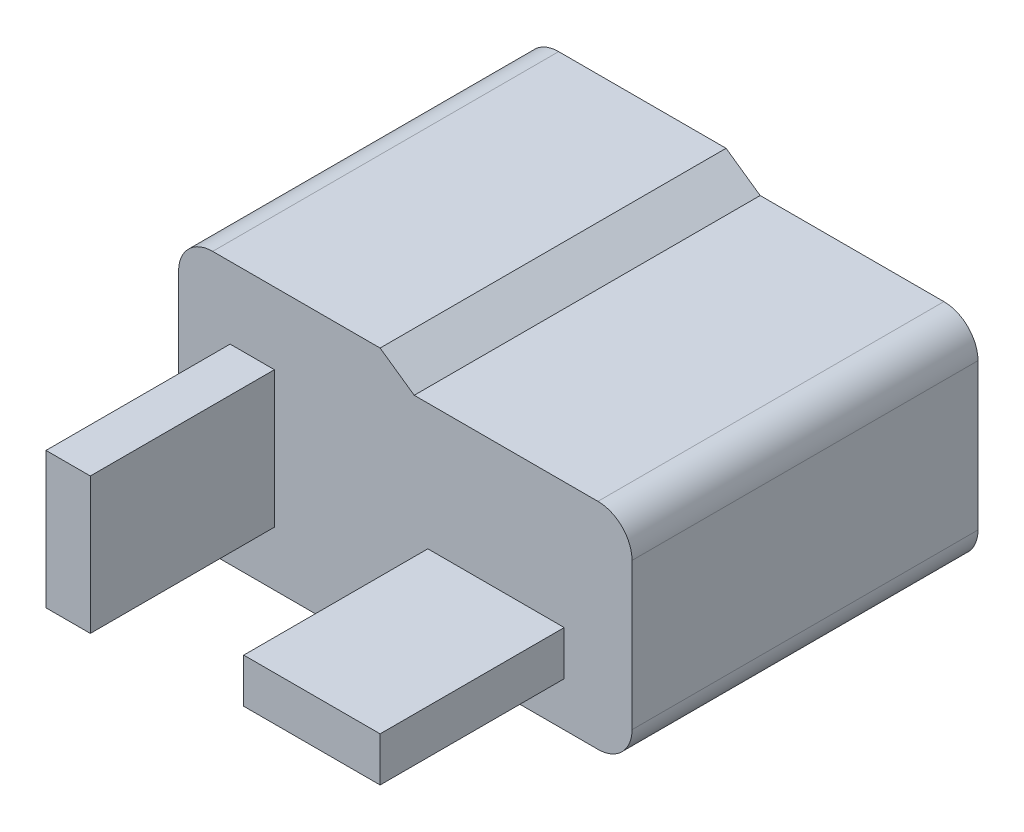
ISO-10303-21;
HEADER;
FILE_DESCRIPTION(('STEP AP214'),'2;1');
FILE_NAME('part.step','',(''),(''),'','','');
FILE_SCHEMA(('AUTOMOTIVE_DESIGN { 1 0 10303 214 1 1 1 1 }'));
ENDSEC;
DATA;
#1=APPLICATION_CONTEXT('core data for automotive mechanical design processes');
#2=APPLICATION_PROTOCOL_DEFINITION('international standard','automotive_design',2000,#1);
#3=PRODUCT_CONTEXT('',#1,'mechanical');
#4=PRODUCT('Part','Part','',(#3));
#5=PRODUCT_RELATED_PRODUCT_CATEGORY('part','',(#4));
#6=PRODUCT_DEFINITION_FORMATION('','',#4);
#7=PRODUCT_DEFINITION_CONTEXT('part definition',#1,'design');
#8=PRODUCT_DEFINITION('design','',#6,#7);
#9=PRODUCT_DEFINITION_SHAPE('','',#8);
#10=(LENGTH_UNIT() NAMED_UNIT(*) SI_UNIT(.MILLI.,.METRE.));
#11=(NAMED_UNIT(*) PLANE_ANGLE_UNIT() SI_UNIT($,.RADIAN.));
#12=(NAMED_UNIT(*) SI_UNIT($,.STERADIAN.) SOLID_ANGLE_UNIT());
#13=UNCERTAINTY_MEASURE_WITH_UNIT(LENGTH_MEASURE(1.E-05),#10,'distance_accuracy_value','');
#14=(GEOMETRIC_REPRESENTATION_CONTEXT(3) GLOBAL_UNCERTAINTY_ASSIGNED_CONTEXT((#13)) GLOBAL_UNIT_ASSIGNED_CONTEXT((#10,
#11,#12)) REPRESENTATION_CONTEXT('',''));
#15=CARTESIAN_POINT('',(0.,0.,0.));
#16=DIRECTION('',(0.,0.,1.));
#17=DIRECTION('',(1.,0.,0.));
#18=AXIS2_PLACEMENT_3D('',#15,#16,#17);
#19=CARTESIAN_POINT('',(0.,0.,9.7));
#20=DIRECTION('',(0.,0.,-1.));
#21=DIRECTION('',(-1.,0.,0.));
#22=AXIS2_PLACEMENT_3D('',#19,#20,#21);
#23=PLANE('',#22);
#24=DIRECTION('',(1.,0.,0.));
#25=VECTOR('',#24,1.);
#26=CARTESIAN_POINT('',(-0.3,-2.25,9.7));
#27=LINE('',#26,#25);
#28=CARTESIAN_POINT('',(-0.3,-2.25,9.7));
#29=VERTEX_POINT('',#28);
#30=CARTESIAN_POINT('',(-3.3,-2.25,9.7));
#31=VERTEX_POINT('',#30);
#32=EDGE_CURVE('E413',#29,#31,#27,.F.);
#33=ORIENTED_EDGE('',*,*,#32,.T.);
#34=DIRECTION('',(0.,1.,0.));
#35=VECTOR('',#34,1.);
#36=CARTESIAN_POINT('',(-3.3,-2.25,9.7));
#37=LINE('',#36,#35);
#38=CARTESIAN_POINT('',(-3.3,2.25,9.7));
#39=VERTEX_POINT('',#38);
#40=EDGE_CURVE('E417',#31,#39,#37,.T.);
#41=ORIENTED_EDGE('',*,*,#40,.T.);
#42=DIRECTION('',(1.,0.,0.));
#43=VECTOR('',#42,1.);
#44=CARTESIAN_POINT('',(-3.3,2.25,9.7));
#45=LINE('',#44,#43);
#46=CARTESIAN_POINT('',(-0.3,2.25,9.7));
#47=VERTEX_POINT('',#46);
#48=EDGE_CURVE('E419',#39,#47,#45,.T.);
#49=ORIENTED_EDGE('',*,*,#48,.T.);
#50=DIRECTION('',(0.,1.,0.));
#51=VECTOR('',#50,1.);
#52=CARTESIAN_POINT('',(-0.3,2.25,9.7));
#53=LINE('',#52,#51);
#54=EDGE_CURVE('E406',#47,#29,#53,.F.);
#55=ORIENTED_EDGE('',*,*,#54,.T.);
#56=EDGE_LOOP('',(#33,#41,#49,#55));
#57=FACE_BOUND('',#56,.T.);
#58=ADVANCED_FACE('F16',(#57),#23,.T.);
#59=CARTESIAN_POINT('',(0.,0.,9.7));
#60=DIRECTION('',(0.,0.,-1.));
#61=DIRECTION('',(-1.,0.,0.));
#62=AXIS2_PLACEMENT_3D('',#59,#60,#61);
#63=PLANE('',#62);
#64=DIRECTION('',(1.,0.,0.));
#65=VECTOR('',#64,1.);
#66=CARTESIAN_POINT('',(5.9,-1.85,9.7));
#67=LINE('',#66,#65);
#68=CARTESIAN_POINT('',(5.9,-1.85,9.7));
#69=VERTEX_POINT('',#68);
#70=CARTESIAN_POINT('',(1.4,-1.85,9.7));
#71=VERTEX_POINT('',#70);
#72=EDGE_CURVE('E396',#69,#71,#67,.F.);
#73=ORIENTED_EDGE('',*,*,#72,.T.);
#74=DIRECTION('',(0.,1.,0.));
#75=VECTOR('',#74,1.);
#76=CARTESIAN_POINT('',(1.4,-1.85,9.7));
#77=LINE('',#76,#75);
#78=CARTESIAN_POINT('',(1.4,1.15,9.7));
#79=VERTEX_POINT('',#78);
#80=EDGE_CURVE('E400',#71,#79,#77,.T.);
#81=ORIENTED_EDGE('',*,*,#80,.T.);
#82=DIRECTION('',(-1.,0.,0.));
#83=VECTOR('',#82,1.);
#84=CARTESIAN_POINT('',(1.4,1.15,9.7));
#85=LINE('',#84,#83);
#86=CARTESIAN_POINT('',(5.9,1.15,9.7));
#87=VERTEX_POINT('',#86);
#88=EDGE_CURVE('E402',#79,#87,#85,.F.);
#89=ORIENTED_EDGE('',*,*,#88,.T.);
#90=DIRECTION('',(0.,1.,0.));
#91=VECTOR('',#90,1.);
#92=CARTESIAN_POINT('',(5.9,1.15,9.7));
#93=LINE('',#92,#91);
#94=EDGE_CURVE('E389',#87,#69,#93,.F.);
#95=ORIENTED_EDGE('',*,*,#94,.T.);
#96=EDGE_LOOP('',(#73,#81,#89,#95));
#97=FACE_BOUND('',#96,.T.);
#98=ADVANCED_FACE('F584',(#97),#63,.T.);
#99=CARTESIAN_POINT('',(-3.3,2.25,9.7));
#100=DIRECTION('',(0.,1.,0.));
#101=DIRECTION('',(0.,0.,1.));
#102=AXIS2_PLACEMENT_3D('',#99,#100,#101);
#103=PLANE('',#102);
#104=DIRECTION('',(0.,0.,1.));
#105=VECTOR('',#104,1.);
#106=CARTESIAN_POINT('',(-0.3,2.25,9.7));
#107=LINE('',#106,#105);
#108=CARTESIAN_POINT('',(-0.3,2.25,0.));
#109=VERTEX_POINT('',#108);
#110=EDGE_CURVE('E408',#109,#47,#107,.T.);
#111=ORIENTED_EDGE('',*,*,#110,.T.);
#112=ORIENTED_EDGE('',*,*,#48,.F.);
#113=DIRECTION('',(0.,0.,1.));
#114=VECTOR('',#113,1.);
#115=CARTESIAN_POINT('',(-3.3,2.25,9.7));
#116=LINE('',#115,#114);
#117=CARTESIAN_POINT('',(-3.3,2.25,0.));
#118=VERTEX_POINT('',#117);
#119=EDGE_CURVE('E415',#39,#118,#116,.F.);
#120=ORIENTED_EDGE('',*,*,#119,.T.);
#121=DIRECTION('',(-1.,0.,0.));
#122=VECTOR('',#121,1.);
#123=CARTESIAN_POINT('',(7.388888888889,2.25,0.));
#124=LINE('',#123,#122);
#125=EDGE_CURVE('E342',#109,#118,#124,.T.);
#126=ORIENTED_EDGE('',*,*,#125,.F.);
#127=EDGE_LOOP('',(#111,#112,#120,#126));
#128=FACE_BOUND('',#127,.T.);
#129=ADVANCED_FACE('F581',(#128),#103,.F.);
#130=CARTESIAN_POINT('',(-3.3,-2.25,9.7));
#131=DIRECTION('',(-1.,0.,0.));
#132=DIRECTION('',(0.,0.,1.));
#133=AXIS2_PLACEMENT_3D('',#130,#131,#132);
#134=PLANE('',#133);
#135=ORIENTED_EDGE('',*,*,#119,.F.);
#136=ORIENTED_EDGE('',*,*,#40,.F.);
#137=DIRECTION('',(0.,0.,1.));
#138=VECTOR('',#137,1.);
#139=CARTESIAN_POINT('',(-3.3,-2.25,9.7));
#140=LINE('',#139,#138);
#141=CARTESIAN_POINT('',(-3.3,-2.25,0.));
#142=VERTEX_POINT('',#141);
#143=EDGE_CURVE('E411',#31,#142,#140,.F.);
#144=ORIENTED_EDGE('',*,*,#143,.T.);
#145=DIRECTION('',(0.,1.,0.));
#146=VECTOR('',#145,1.);
#147=CARTESIAN_POINT('',(-3.3,-3.85,0.));
#148=LINE('',#147,#146);
#149=EDGE_CURVE('E339',#118,#142,#148,.F.);
#150=ORIENTED_EDGE('',*,*,#149,.F.);
#151=EDGE_LOOP('',(#135,#136,#144,#150));
#152=FACE_BOUND('',#151,.T.);
#153=ADVANCED_FACE('F577',(#152),#134,.F.);
#154=CARTESIAN_POINT('',(-0.3,-2.25,9.7));
#155=DIRECTION('',(0.,-1.,0.));
#156=DIRECTION('',(1.,0.,0.));
#157=AXIS2_PLACEMENT_3D('',#154,#155,#156);
#158=PLANE('',#157);
#159=ORIENTED_EDGE('',*,*,#143,.F.);
#160=ORIENTED_EDGE('',*,*,#32,.F.);
#161=DIRECTION('',(0.,0.,1.));
#162=VECTOR('',#161,1.);
#163=CARTESIAN_POINT('',(-0.3,-2.25,9.7));
#164=LINE('',#163,#162);
#165=CARTESIAN_POINT('',(-0.3,-2.25,0.));
#166=VERTEX_POINT('',#165);
#167=EDGE_CURVE('E404',#29,#166,#164,.F.);
#168=ORIENTED_EDGE('',*,*,#167,.T.);
#169=DIRECTION('',(-1.,0.,0.));
#170=VECTOR('',#169,1.);
#171=CARTESIAN_POINT('',(7.388888888889,-2.25,0.));
#172=LINE('',#171,#170);
#173=EDGE_CURVE('E336',#142,#166,#172,.F.);
#174=ORIENTED_EDGE('',*,*,#173,.F.);
#175=EDGE_LOOP('',(#159,#160,#168,#174));
#176=FACE_BOUND('',#175,.T.);
#177=ADVANCED_FACE('F573',(#176),#158,.F.);
#178=CARTESIAN_POINT('',(-0.3,2.25,9.7));
#179=DIRECTION('',(1.,0.,0.));
#180=DIRECTION('',(0.,1.,0.));
#181=AXIS2_PLACEMENT_3D('',#178,#179,#180);
#182=PLANE('',#181);
#183=ORIENTED_EDGE('',*,*,#167,.F.);
#184=ORIENTED_EDGE('',*,*,#54,.F.);
#185=ORIENTED_EDGE('',*,*,#110,.F.);
#186=DIRECTION('',(0.,1.,0.));
#187=VECTOR('',#186,1.);
#188=CARTESIAN_POINT('',(-0.3,-3.85,0.));
#189=LINE('',#188,#187);
#190=EDGE_CURVE('E333',#166,#109,#189,.T.);
#191=ORIENTED_EDGE('',*,*,#190,.F.);
#192=EDGE_LOOP('',(#183,#184,#185,#191));
#193=FACE_BOUND('',#192,.T.);
#194=ADVANCED_FACE('F569',(#193),#182,.F.);
#195=CARTESIAN_POINT('',(1.4,1.15,9.7));
#196=DIRECTION('',(0.,1.,0.));
#197=DIRECTION('',(-1.,0.,0.));
#198=AXIS2_PLACEMENT_3D('',#195,#196,#197);
#199=PLANE('',#198);
#200=DIRECTION('',(0.,0.,-1.));
#201=VECTOR('',#200,1.);
#202=CARTESIAN_POINT('',(5.9,1.15,9.7));
#203=LINE('',#202,#201);
#204=CARTESIAN_POINT('',(5.9,1.15,0.));
#205=VERTEX_POINT('',#204);
#206=EDGE_CURVE('E391',#205,#87,#203,.F.);
#207=ORIENTED_EDGE('',*,*,#206,.T.);
#208=ORIENTED_EDGE('',*,*,#88,.F.);
#209=DIRECTION('',(0.,0.,1.));
#210=VECTOR('',#209,1.);
#211=CARTESIAN_POINT('',(1.4,1.15,9.7));
#212=LINE('',#211,#210);
#213=CARTESIAN_POINT('',(1.4,1.15,0.));
#214=VERTEX_POINT('',#213);
#215=EDGE_CURVE('E398',#79,#214,#212,.F.);
#216=ORIENTED_EDGE('',*,*,#215,.T.);
#217=DIRECTION('',(-1.,0.,0.));
#218=VECTOR('',#217,1.);
#219=CARTESIAN_POINT('',(7.388888888889,1.15,0.));
#220=LINE('',#219,#218);
#221=EDGE_CURVE('E330',#205,#214,#220,.T.);
#222=ORIENTED_EDGE('',*,*,#221,.F.);
#223=EDGE_LOOP('',(#207,#208,#216,#222));
#224=FACE_BOUND('',#223,.T.);
#225=ADVANCED_FACE('F565',(#224),#199,.F.);
#226=CARTESIAN_POINT('',(1.4,-1.85,9.7));
#227=DIRECTION('',(-1.,0.,0.));
#228=DIRECTION('',(0.,0.,1.));
#229=AXIS2_PLACEMENT_3D('',#226,#227,#228);
#230=PLANE('',#229);
#231=ORIENTED_EDGE('',*,*,#215,.F.);
#232=ORIENTED_EDGE('',*,*,#80,.F.);
#233=DIRECTION('',(0.,0.,-1.));
#234=VECTOR('',#233,1.);
#235=CARTESIAN_POINT('',(1.4,-1.85,9.7));
#236=LINE('',#235,#234);
#237=CARTESIAN_POINT('',(1.4,-1.85,0.));
#238=VERTEX_POINT('',#237);
#239=EDGE_CURVE('E394',#71,#238,#236,.T.);
#240=ORIENTED_EDGE('',*,*,#239,.T.);
#241=DIRECTION('',(0.,1.,0.));
#242=VECTOR('',#241,1.);
#243=CARTESIAN_POINT('',(1.4,-3.85,0.));
#244=LINE('',#243,#242);
#245=EDGE_CURVE('E327',#214,#238,#244,.F.);
#246=ORIENTED_EDGE('',*,*,#245,.F.);
#247=EDGE_LOOP('',(#231,#232,#240,#246));
#248=FACE_BOUND('',#247,.T.);
#249=ADVANCED_FACE('F561',(#248),#230,.F.);
#250=CARTESIAN_POINT('',(5.9,-1.85,9.7));
#251=DIRECTION('',(0.,-1.,0.));
#252=DIRECTION('',(0.,0.,-1.));
#253=AXIS2_PLACEMENT_3D('',#250,#251,#252);
#254=PLANE('',#253);
#255=ORIENTED_EDGE('',*,*,#239,.F.);
#256=ORIENTED_EDGE('',*,*,#72,.F.);
#257=DIRECTION('',(0.,0.,-1.));
#258=VECTOR('',#257,1.);
#259=CARTESIAN_POINT('',(5.9,-1.85,9.7));
#260=LINE('',#259,#258);
#261=CARTESIAN_POINT('',(5.9,-1.85,0.));
#262=VERTEX_POINT('',#261);
#263=EDGE_CURVE('E387',#69,#262,#260,.T.);
#264=ORIENTED_EDGE('',*,*,#263,.T.);
#265=DIRECTION('',(-1.,0.,0.));
#266=VECTOR('',#265,1.);
#267=CARTESIAN_POINT('',(7.388888888889,-1.85,0.));
#268=LINE('',#267,#266);
#269=EDGE_CURVE('E324',#238,#262,#268,.F.);
#270=ORIENTED_EDGE('',*,*,#269,.F.);
#271=EDGE_LOOP('',(#255,#256,#264,#270));
#272=FACE_BOUND('',#271,.T.);
#273=ADVANCED_FACE('F557',(#272),#254,.F.);
#274=CARTESIAN_POINT('',(5.9,1.15,9.7));
#275=DIRECTION('',(1.,0.,0.));
#276=DIRECTION('',(0.,0.,-1.));
#277=AXIS2_PLACEMENT_3D('',#274,#275,#276);
#278=PLANE('',#277);
#279=ORIENTED_EDGE('',*,*,#263,.F.);
#280=ORIENTED_EDGE('',*,*,#94,.F.);
#281=ORIENTED_EDGE('',*,*,#206,.F.);
#282=DIRECTION('',(0.,1.,0.));
#283=VECTOR('',#282,1.);
#284=CARTESIAN_POINT('',(5.9,-3.85,0.));
#285=LINE('',#284,#283);
#286=EDGE_CURVE('E320',#262,#205,#285,.T.);
#287=ORIENTED_EDGE('',*,*,#286,.F.);
#288=EDGE_LOOP('',(#279,#280,#281,#287));
#289=FACE_BOUND('',#288,.T.);
#290=ADVANCED_FACE('F554',(#289),#278,.F.);
#291=CARTESIAN_POINT('',(1.4,-1.85,15.547407407407));
#292=DIRECTION('',(1.,0.,0.));
#293=DIRECTION('',(0.,0.,-1.));
#294=AXIS2_PLACEMENT_3D('',#291,#292,#293);
#295=PLANE('',#294);
#296=DIRECTION('',(0.,0.,1.));
#297=VECTOR('',#296,1.);
#298=CARTESIAN_POINT('',(1.4,-1.85,15.547407407407));
#299=LINE('',#298,#297);
#300=CARTESIAN_POINT('',(1.4,-1.85,10.147407407407));
#301=VERTEX_POINT('',#300);
#302=CARTESIAN_POINT('',(1.4,-1.85,15.547407407407));
#303=VERTEX_POINT('',#302);
#304=EDGE_CURVE('E298',#301,#303,#299,.T.);
#305=ORIENTED_EDGE('',*,*,#304,.T.);
#306=DIRECTION('',(0.,1.,0.));
#307=VECTOR('',#306,1.);
#308=CARTESIAN_POINT('',(1.4,0.,15.547407407407));
#309=LINE('',#308,#307);
#310=CARTESIAN_POINT('',(1.4,-0.55,15.547407407407));
#311=VERTEX_POINT('',#310);
#312=EDGE_CURVE('E383',#303,#311,#309,.T.);
#313=ORIENTED_EDGE('',*,*,#312,.T.);
#314=DIRECTION('',(0.,0.,-1.));
#315=VECTOR('',#314,1.);
#316=CARTESIAN_POINT('',(1.4,-0.55,15.547407407407));
#317=LINE('',#316,#315);
#318=CARTESIAN_POINT('',(1.4,-0.55,10.147407407407));
#319=VERTEX_POINT('',#318);
#320=EDGE_CURVE('E300',#311,#319,#317,.T.);
#321=ORIENTED_EDGE('',*,*,#320,.T.);
#322=DIRECTION('',(0.,1.,0.));
#323=VECTOR('',#322,1.);
#324=CARTESIAN_POINT('',(1.4,-1.85,10.147407407407));
#325=LINE('',#324,#323);
#326=EDGE_CURVE('E385',#301,#319,#325,.T.);
#327=ORIENTED_EDGE('',*,*,#326,.F.);
#328=EDGE_LOOP('',(#305,#313,#321,#327));
#329=FACE_BOUND('',#328,.T.);
#330=ADVANCED_FACE('F531',(#329),#295,.F.);
#331=CARTESIAN_POINT('',(0.,0.,15.547407407407));
#332=DIRECTION('',(0.,0.,-1.));
#333=DIRECTION('',(-1.,0.,0.));
#334=AXIS2_PLACEMENT_3D('',#331,#332,#333);
#335=PLANE('',#334);
#336=ORIENTED_EDGE('',*,*,#312,.F.);
#337=DIRECTION('',(-1.,0.,0.));
#338=VECTOR('',#337,1.);
#339=CARTESIAN_POINT('',(5.4,-1.85,15.547407407407));
#340=LINE('',#339,#338);
#341=CARTESIAN_POINT('',(5.4,-1.85,15.547407407407));
#342=VERTEX_POINT('',#341);
#343=EDGE_CURVE('E296',#303,#342,#340,.F.);
#344=ORIENTED_EDGE('',*,*,#343,.T.);
#345=DIRECTION('',(0.,1.,0.));
#346=VECTOR('',#345,1.);
#347=CARTESIAN_POINT('',(5.4,-0.55,15.547407407407));
#348=LINE('',#347,#346);
#349=CARTESIAN_POINT('',(5.4,-0.55,15.547407407407));
#350=VERTEX_POINT('',#349);
#351=EDGE_CURVE('E381',#342,#350,#348,.T.);
#352=ORIENTED_EDGE('',*,*,#351,.T.);
#353=DIRECTION('',(1.,0.,0.));
#354=VECTOR('',#353,1.);
#355=CARTESIAN_POINT('',(1.4,-0.55,15.547407407407));
#356=LINE('',#355,#354);
#357=EDGE_CURVE('E303',#350,#311,#356,.F.);
#358=ORIENTED_EDGE('',*,*,#357,.T.);
#359=EDGE_LOOP('',(#336,#344,#352,#358));
#360=FACE_BOUND('',#359,.T.);
#361=ADVANCED_FACE('F536',(#360),#335,.F.);
#362=CARTESIAN_POINT('',(5.4,-0.55,15.547407407407));
#363=DIRECTION('',(-1.,0.,0.));
#364=DIRECTION('',(0.,0.,1.));
#365=AXIS2_PLACEMENT_3D('',#362,#363,#364);
#366=PLANE('',#365);
#367=DIRECTION('',(0.,0.,-1.));
#368=VECTOR('',#367,1.);
#369=CARTESIAN_POINT('',(5.4,-0.55,15.547407407407));
#370=LINE('',#369,#368);
#371=CARTESIAN_POINT('',(5.4,-0.55,10.147407407407));
#372=VERTEX_POINT('',#371);
#373=EDGE_CURVE('E306',#372,#350,#370,.F.);
#374=ORIENTED_EDGE('',*,*,#373,.T.);
#375=ORIENTED_EDGE('',*,*,#351,.F.);
#376=DIRECTION('',(0.,0.,1.));
#377=VECTOR('',#376,1.);
#378=CARTESIAN_POINT('',(5.4,-1.85,15.547407407407));
#379=LINE('',#378,#377);
#380=CARTESIAN_POINT('',(5.4,-1.85,10.147407407407));
#381=VERTEX_POINT('',#380);
#382=EDGE_CURVE('E291',#342,#381,#379,.F.);
#383=ORIENTED_EDGE('',*,*,#382,.T.);
#384=DIRECTION('',(0.,1.,0.));
#385=VECTOR('',#384,1.);
#386=CARTESIAN_POINT('',(5.4,-0.55,10.147407407407));
#387=LINE('',#386,#385);
#388=EDGE_CURVE('E208',#372,#381,#387,.F.);
#389=ORIENTED_EDGE('',*,*,#388,.F.);
#390=EDGE_LOOP('',(#374,#375,#383,#389));
#391=FACE_BOUND('',#390,.T.);
#392=ADVANCED_FACE('F540',(#391),#366,.F.);
#393=CARTESIAN_POINT('',(6.388888888889,-2.15,0.));
#394=DIRECTION('',(0.,0.,-1.));
#395=DIRECTION('',(-1.,0.,0.));
#396=AXIS2_PLACEMENT_3D('',#393,#394,#395);
#397=CYLINDRICAL_SURFACE('',#396,1.);
#398=CARTESIAN_POINT('',(6.388888888889,-2.15,10.147407407407));
#399=DIRECTION('',(0.,0.,-1.));
#400=DIRECTION('',(-1.,0.,0.));
#401=AXIS2_PLACEMENT_3D('',#398,#399,#400);
#402=CIRCLE('',#401,1.);
#403=CARTESIAN_POINT('',(7.388888888889,-2.15,10.147407407407));
#404=VERTEX_POINT('',#403);
#405=CARTESIAN_POINT('',(6.388888888889,-3.15,10.147407407407));
#406=VERTEX_POINT('',#405);
#407=EDGE_CURVE('E19',#404,#406,#402,.T.);
#408=ORIENTED_EDGE('',*,*,#407,.T.);
#409=DIRECTION('',(0.,0.,1.));
#410=VECTOR('',#409,1.);
#411=CARTESIAN_POINT('',(6.388888888889,-3.15,0.));
#412=LINE('',#411,#410);
#413=CARTESIAN_POINT('',(6.388888888889,-3.15,0.));
#414=VERTEX_POINT('',#413);
#415=EDGE_CURVE('E202',#406,#414,#412,.F.);
#416=ORIENTED_EDGE('',*,*,#415,.T.);
#417=CARTESIAN_POINT('',(6.388888888889,-2.15,0.));
#418=DIRECTION('',(0.,0.,-1.));
#419=DIRECTION('',(-1.,0.,0.));
#420=AXIS2_PLACEMENT_3D('',#417,#418,#419);
#421=CIRCLE('',#420,1.);
#422=CARTESIAN_POINT('',(7.388888888889,-2.15,0.));
#423=VERTEX_POINT('',#422);
#424=EDGE_CURVE('E323',#423,#414,#421,.T.);
#425=ORIENTED_EDGE('',*,*,#424,.F.);
#426=DIRECTION('',(0.,0.,-1.));
#427=VECTOR('',#426,1.);
#428=CARTESIAN_POINT('',(7.388888888889,-2.15,10.147407407407));
#429=LINE('',#428,#427);
#430=EDGE_CURVE('E205',#404,#423,#429,.T.);
#431=ORIENTED_EDGE('',*,*,#430,.F.);
#432=EDGE_LOOP('',(#408,#416,#425,#431));
#433=FACE_BOUND('',#432,.T.);
#434=ADVANCED_FACE('F201',(#433),#397,.T.);
#435=CARTESIAN_POINT('',(6.388888888889,2.15,0.));
#436=DIRECTION('',(0.,0.,1.));
#437=DIRECTION('',(1.,0.,0.));
#438=AXIS2_PLACEMENT_3D('',#435,#436,#437);
#439=CYLINDRICAL_SURFACE('',#438,1.);
#440=CARTESIAN_POINT('',(6.388888888889,2.15,0.));
#441=DIRECTION('',(0.,0.,1.));
#442=DIRECTION('',(1.,0.,0.));
#443=AXIS2_PLACEMENT_3D('',#440,#441,#442);
#444=CIRCLE('',#443,1.);
#445=CARTESIAN_POINT('',(6.388888888889,3.15,0.));
#446=VERTEX_POINT('',#445);
#447=CARTESIAN_POINT('',(7.388888888889,2.15,0.));
#448=VERTEX_POINT('',#447);
#449=EDGE_CURVE('E368',#446,#448,#444,.F.);
#450=ORIENTED_EDGE('',*,*,#449,.F.);
#451=DIRECTION('',(0.,0.,1.));
#452=VECTOR('',#451,1.);
#453=CARTESIAN_POINT('',(6.388888888889,3.15,0.));
#454=LINE('',#453,#452);
#455=CARTESIAN_POINT('',(6.388888888889,3.15,10.147407407407));
#456=VERTEX_POINT('',#455);
#457=EDGE_CURVE('E277',#446,#456,#454,.T.);
#458=ORIENTED_EDGE('',*,*,#457,.T.);
#459=CARTESIAN_POINT('',(6.388888888889,2.15,10.147407407407));
#460=DIRECTION('',(0.,0.,1.));
#461=DIRECTION('',(1.,0.,0.));
#462=AXIS2_PLACEMENT_3D('',#459,#460,#461);
#463=CIRCLE('',#462,1.);
#464=CARTESIAN_POINT('',(7.388888888889,2.15,10.147407407407));
#465=VERTEX_POINT('',#464);
#466=EDGE_CURVE('E207',#456,#465,#463,.F.);
#467=ORIENTED_EDGE('',*,*,#466,.T.);
#468=DIRECTION('',(0.,0.,-1.));
#469=VECTOR('',#468,1.);
#470=CARTESIAN_POINT('',(7.388888888889,2.15,10.147407407407));
#471=LINE('',#470,#469);
#472=EDGE_CURVE('E283',#448,#465,#471,.F.);
#473=ORIENTED_EDGE('',*,*,#472,.F.);
#474=EDGE_LOOP('',(#450,#458,#467,#473));
#475=FACE_BOUND('',#474,.T.);
#476=ADVANCED_FACE('F430',(#475),#439,.T.);
#477=CARTESIAN_POINT('',(0.,3.85,0.));
#478=DIRECTION('',(0.573462344363127,0.819231920519181,0.));
#479=DIRECTION('',(-0.819231920519181,0.573462344363127,0.));
#480=AXIS2_PLACEMENT_3D('',#477,#478,#479);
#481=PLANE('',#480);
#482=DIRECTION('',(0.81923192051904,-0.573462344363329,0.));
#483=VECTOR('',#482,1.);
#484=CARTESIAN_POINT('',(0.,3.85,0.));
#485=LINE('',#484,#483);
#486=CARTESIAN_POINT('',(0.,3.85,0.));
#487=VERTEX_POINT('',#486);
#488=CARTESIAN_POINT('',(1.,3.15,0.));
#489=VERTEX_POINT('',#488);
#490=EDGE_CURVE('E365',#487,#489,#485,.T.);
#491=ORIENTED_EDGE('',*,*,#490,.F.);
#492=DIRECTION('',(0.,0.,1.));
#493=VECTOR('',#492,1.);
#494=CARTESIAN_POINT('',(0.,3.85,0.));
#495=LINE('',#494,#493);
#496=CARTESIAN_POINT('',(0.,3.85,10.147407407407));
#497=VERTEX_POINT('',#496);
#498=EDGE_CURVE('E271',#497,#487,#495,.F.);
#499=ORIENTED_EDGE('',*,*,#498,.F.);
#500=DIRECTION('',(-0.819231920519181,0.573462344363127,0.));
#501=VECTOR('',#500,1.);
#502=CARTESIAN_POINT('',(0.,3.85,10.147407407407));
#503=LINE('',#502,#501);
#504=CARTESIAN_POINT('',(1.00000000000006,3.15000000000008,10.147407407407));
#505=VERTEX_POINT('',#504);
#506=EDGE_CURVE('E357',#497,#505,#503,.F.);
#507=ORIENTED_EDGE('',*,*,#506,.T.);
#508=DIRECTION('',(0.,0.,1.));
#509=VECTOR('',#508,1.);
#510=CARTESIAN_POINT('',(1.,3.15,0.));
#511=LINE('',#510,#509);
#512=EDGE_CURVE('E281',#505,#489,#511,.F.);
#513=ORIENTED_EDGE('',*,*,#512,.T.);
#514=EDGE_LOOP('',(#491,#499,#507,#513));
#515=FACE_BOUND('',#514,.T.);
#516=ADVANCED_FACE('F630',(#515),#481,.T.);
#517=CARTESIAN_POINT('',(-4.911111111111,2.85,0.));
#518=DIRECTION('',(0.,0.,1.));
#519=DIRECTION('',(1.,0.,0.));
#520=AXIS2_PLACEMENT_3D('',#517,#518,#519);
#521=CYLINDRICAL_SURFACE('',#520,1.);
#522=CARTESIAN_POINT('',(-4.911111111111,2.85,10.147407407407));
#523=DIRECTION('',(0.,0.,1.));
#524=DIRECTION('',(1.,0.,0.));
#525=AXIS2_PLACEMENT_3D('',#522,#523,#524);
#526=CIRCLE('',#525,1.);
#527=CARTESIAN_POINT('',(-5.911111111111,2.85,10.147407407407));
#528=VERTEX_POINT('',#527);
#529=CARTESIAN_POINT('',(-4.911111111111,3.85,10.147407407407));
#530=VERTEX_POINT('',#529);
#531=EDGE_CURVE('E352',#528,#530,#526,.F.);
#532=ORIENTED_EDGE('',*,*,#531,.T.);
#533=DIRECTION('',(0.,0.,1.));
#534=VECTOR('',#533,1.);
#535=CARTESIAN_POINT('',(-4.911111111111,3.85,0.));
#536=LINE('',#535,#534);
#537=CARTESIAN_POINT('',(-4.911111111111,3.85,0.));
#538=VERTEX_POINT('',#537);
#539=EDGE_CURVE('E268',#538,#530,#536,.T.);
#540=ORIENTED_EDGE('',*,*,#539,.F.);
#541=CARTESIAN_POINT('',(-4.911111111111,2.85,0.));
#542=DIRECTION('',(0.,0.,1.));
#543=DIRECTION('',(1.,0.,0.));
#544=AXIS2_PLACEMENT_3D('',#541,#542,#543);
#545=CIRCLE('',#544,1.);
#546=CARTESIAN_POINT('',(-5.911111111111,2.85,0.));
#547=VERTEX_POINT('',#546);
#548=EDGE_CURVE('E348',#547,#538,#545,.F.);
#549=ORIENTED_EDGE('',*,*,#548,.F.);
#550=DIRECTION('',(0.,0.,1.));
#551=VECTOR('',#550,1.);
#552=CARTESIAN_POINT('',(-5.911111111111,2.85,0.));
#553=LINE('',#552,#551);
#554=EDGE_CURVE('E259',#528,#547,#553,.F.);
#555=ORIENTED_EDGE('',*,*,#554,.F.);
#556=EDGE_LOOP('',(#532,#540,#549,#555));
#557=FACE_BOUND('',#556,.T.);
#558=ADVANCED_FACE('F624',(#557),#521,.T.);
#559=CARTESIAN_POINT('',(1.,-3.15,0.));
#560=DIRECTION('',(0.573462344363127,-0.819231920519181,0.));
#561=DIRECTION('',(0.819231920519181,0.573462344363127,0.));
#562=AXIS2_PLACEMENT_3D('',#559,#560,#561);
#563=PLANE('',#562);
#564=DIRECTION('',(-0.819231920519041,-0.573462344363327,0.));
#565=VECTOR('',#564,1.);
#566=CARTESIAN_POINT('',(1.,-3.15,0.));
#567=LINE('',#566,#565);
#568=CARTESIAN_POINT('',(0.999999999999999,-3.15,0.));
#569=VERTEX_POINT('',#568);
#570=CARTESIAN_POINT('',(0.,-3.85,0.));
#571=VERTEX_POINT('',#570);
#572=EDGE_CURVE('E345',#569,#571,#567,.T.);
#573=ORIENTED_EDGE('',*,*,#572,.F.);
#574=DIRECTION('',(0.,0.,1.));
#575=VECTOR('',#574,1.);
#576=CARTESIAN_POINT('',(1.,-3.15,0.));
#577=LINE('',#576,#575);
#578=CARTESIAN_POINT('',(0.999999999999999,-3.15,10.147407407407));
#579=VERTEX_POINT('',#578);
#580=EDGE_CURVE('E217',#569,#579,#577,.T.);
#581=ORIENTED_EDGE('',*,*,#580,.T.);
#582=DIRECTION('',(0.819231920519181,0.573462344363127,0.));
#583=VECTOR('',#582,1.);
#584=CARTESIAN_POINT('',(1.,-3.15,10.147407407407));
#585=LINE('',#584,#583);
#586=CARTESIAN_POINT('',(0.,-3.84999999999992,10.147407407407));
#587=VERTEX_POINT('',#586);
#588=EDGE_CURVE('E222',#579,#587,#585,.F.);
#589=ORIENTED_EDGE('',*,*,#588,.T.);
#590=DIRECTION('',(0.,0.,1.));
#591=VECTOR('',#590,1.);
#592=CARTESIAN_POINT('',(0.,-3.85,0.));
#593=LINE('',#592,#591);
#594=EDGE_CURVE('E257',#587,#571,#593,.F.);
#595=ORIENTED_EDGE('',*,*,#594,.T.);
#596=EDGE_LOOP('',(#573,#581,#589,#595));
#597=FACE_BOUND('',#596,.T.);
#598=ADVANCED_FACE('F605',(#597),#563,.T.);
#599=CARTESIAN_POINT('',(7.388888888889,-3.85,0.));
#600=DIRECTION('',(0.,0.,-1.));
#601=DIRECTION('',(-1.,0.,0.));
#602=AXIS2_PLACEMENT_3D('',#599,#600,#601);
#603=PLANE('',#602);
#604=DIRECTION('',(1.,0.,0.));
#605=VECTOR('',#604,1.);
#606=CARTESIAN_POINT('',(0.,3.15,0.));
#607=LINE('',#606,#605);
#608=EDGE_CURVE('E280',#489,#446,#607,.T.);
#609=ORIENTED_EDGE('',*,*,#608,.T.);
#610=ORIENTED_EDGE('',*,*,#449,.T.);
#611=DIRECTION('',(0.,1.,0.));
#612=VECTOR('',#611,1.);
#613=CARTESIAN_POINT('',(7.388888888889,-3.85,0.));
#614=LINE('',#613,#612);
#615=EDGE_CURVE('E287',#423,#448,#614,.T.);
#616=ORIENTED_EDGE('',*,*,#615,.F.);
#617=ORIENTED_EDGE('',*,*,#424,.T.);
#618=DIRECTION('',(1.,0.,0.));
#619=VECTOR('',#618,1.);
#620=CARTESIAN_POINT('',(7.5,-3.15,0.));
#621=LINE('',#620,#619);
#622=EDGE_CURVE('E216',#414,#569,#621,.F.);
#623=ORIENTED_EDGE('',*,*,#622,.T.);
#624=ORIENTED_EDGE('',*,*,#572,.T.);
#625=DIRECTION('',(1.,0.,0.));
#626=VECTOR('',#625,1.);
#627=CARTESIAN_POINT('',(0.,-3.85,0.));
#628=LINE('',#627,#626);
#629=CARTESIAN_POINT('',(-4.911111111111,-3.85,0.));
#630=VERTEX_POINT('',#629);
#631=EDGE_CURVE('E256',#571,#630,#628,.F.);
#632=ORIENTED_EDGE('',*,*,#631,.T.);
#633=CARTESIAN_POINT('',(-4.911111111111,-2.85,0.));
#634=DIRECTION('',(0.,0.,-1.));
#635=DIRECTION('',(-1.,0.,0.));
#636=AXIS2_PLACEMENT_3D('',#633,#634,#635);
#637=CIRCLE('',#636,1.);
#638=CARTESIAN_POINT('',(-5.911111111111,-2.85,0.));
#639=VERTEX_POINT('',#638);
#640=EDGE_CURVE('E422',#639,#630,#637,.F.);
#641=ORIENTED_EDGE('',*,*,#640,.F.);
#642=DIRECTION('',(0.,1.,0.));
#643=VECTOR('',#642,1.);
#644=CARTESIAN_POINT('',(-5.911111111111,-3.85,0.));
#645=LINE('',#644,#643);
#646=EDGE_CURVE('E267',#547,#639,#645,.F.);
#647=ORIENTED_EDGE('',*,*,#646,.F.);
#648=ORIENTED_EDGE('',*,*,#548,.T.);
#649=DIRECTION('',(1.,0.,0.));
#650=VECTOR('',#649,1.);
#651=CARTESIAN_POINT('',(0.,3.85,0.));
#652=LINE('',#651,#650);
#653=EDGE_CURVE('E272',#487,#538,#652,.F.);
#654=ORIENTED_EDGE('',*,*,#653,.F.);
#655=ORIENTED_EDGE('',*,*,#490,.T.);
#656=EDGE_LOOP('',(#609,#610,#616,#617,#623,#624,#632,#641,#647,#648,#654,#655));
#657=FACE_BOUND('',#656,.T.);
#658=ORIENTED_EDGE('',*,*,#269,.T.);
#659=ORIENTED_EDGE('',*,*,#286,.T.);
#660=ORIENTED_EDGE('',*,*,#221,.T.);
#661=ORIENTED_EDGE('',*,*,#245,.T.);
#662=EDGE_LOOP('',(#658,#659,#660,#661));
#663=FACE_BOUND('',#662,.T.);
#664=ORIENTED_EDGE('',*,*,#173,.T.);
#665=ORIENTED_EDGE('',*,*,#190,.T.);
#666=ORIENTED_EDGE('',*,*,#125,.T.);
#667=ORIENTED_EDGE('',*,*,#149,.T.);
#668=EDGE_LOOP('',(#664,#665,#666,#667));
#669=FACE_BOUND('',#668,.T.);
#670=ADVANCED_FACE('F438',(#657,#663,#669),#603,.T.);
#671=CARTESIAN_POINT('',(-4.911111111111,-2.85,0.));
#672=DIRECTION('',(0.,0.,-1.));
#673=DIRECTION('',(-1.,0.,0.));
#674=AXIS2_PLACEMENT_3D('',#671,#672,#673);
#675=CYLINDRICAL_SURFACE('',#674,1.);
#676=CARTESIAN_POINT('',(-4.911111111111,-2.85,10.147407407407));
#677=DIRECTION('',(0.,0.,-1.));
#678=DIRECTION('',(-1.,0.,0.));
#679=AXIS2_PLACEMENT_3D('',#676,#677,#678);
#680=CIRCLE('',#679,1.);
#681=CARTESIAN_POINT('',(-4.911111111111,-3.85,10.147407407407));
#682=VERTEX_POINT('',#681);
#683=CARTESIAN_POINT('',(-5.911111111111,-2.85,10.147407407407));
#684=VERTEX_POINT('',#683);
#685=EDGE_CURVE('E316',#682,#684,#680,.T.);
#686=ORIENTED_EDGE('',*,*,#685,.T.);
#687=DIRECTION('',(0.,0.,1.));
#688=VECTOR('',#687,1.);
#689=CARTESIAN_POINT('',(-5.911111111111,-2.85,0.));
#690=LINE('',#689,#688);
#691=EDGE_CURVE('E264',#639,#684,#690,.T.);
#692=ORIENTED_EDGE('',*,*,#691,.F.);
#693=ORIENTED_EDGE('',*,*,#640,.T.);
#694=DIRECTION('',(0.,0.,1.));
#695=VECTOR('',#694,1.);
#696=CARTESIAN_POINT('',(-4.911111111111,-3.85,0.));
#697=LINE('',#696,#695);
#698=EDGE_CURVE('E253',#630,#682,#697,.T.);
#699=ORIENTED_EDGE('',*,*,#698,.T.);
#700=EDGE_LOOP('',(#686,#692,#693,#699));
#701=FACE_BOUND('',#700,.T.);
#702=ADVANCED_FACE('F489',(#701),#675,.T.);
#703=CARTESIAN_POINT('',(-3.1,-2.25,15.547407407407));
#704=DIRECTION('',(0.,1.,0.));
#705=DIRECTION('',(-1.,0.,0.));
#706=AXIS2_PLACEMENT_3D('',#703,#704,#705);
#707=PLANE('',#706);
#708=DIRECTION('',(0.,0.,1.));
#709=VECTOR('',#708,1.);
#710=CARTESIAN_POINT('',(-3.1,-2.25,15.547407407407));
#711=LINE('',#710,#709);
#712=CARTESIAN_POINT('',(-3.1,-2.25,10.147407407407));
#713=VERTEX_POINT('',#712);
#714=CARTESIAN_POINT('',(-3.1,-2.25,15.547407407407));
#715=VERTEX_POINT('',#714);
#716=EDGE_CURVE('E242',#713,#715,#711,.T.);
#717=ORIENTED_EDGE('',*,*,#716,.T.);
#718=DIRECTION('',(-1.,0.,0.));
#719=VECTOR('',#718,1.);
#720=CARTESIAN_POINT('',(0.,-2.25,15.547407407407));
#721=LINE('',#720,#719);
#722=CARTESIAN_POINT('',(-4.4,-2.25,15.547407407407));
#723=VERTEX_POINT('',#722);
#724=EDGE_CURVE('E312',#715,#723,#721,.T.);
#725=ORIENTED_EDGE('',*,*,#724,.T.);
#726=DIRECTION('',(0.,0.,-1.));
#727=VECTOR('',#726,1.);
#728=CARTESIAN_POINT('',(-4.4,-2.25,15.547407407407));
#729=LINE('',#728,#727);
#730=CARTESIAN_POINT('',(-4.4,-2.25,10.147407407407));
#731=VERTEX_POINT('',#730);
#732=EDGE_CURVE('E244',#723,#731,#729,.T.);
#733=ORIENTED_EDGE('',*,*,#732,.T.);
#734=DIRECTION('',(-1.,0.,0.));
#735=VECTOR('',#734,1.);
#736=CARTESIAN_POINT('',(-3.1,-2.25,10.147407407407));
#737=LINE('',#736,#735);
#738=EDGE_CURVE('E314',#713,#731,#737,.T.);
#739=ORIENTED_EDGE('',*,*,#738,.F.);
#740=EDGE_LOOP('',(#717,#725,#733,#739));
#741=FACE_BOUND('',#740,.T.);
#742=ADVANCED_FACE('F477',(#741),#707,.F.);
#743=CARTESIAN_POINT('',(0.,0.,15.547407407407));
#744=DIRECTION('',(0.,0.,-1.));
#745=DIRECTION('',(-1.,0.,0.));
#746=AXIS2_PLACEMENT_3D('',#743,#744,#745);
#747=PLANE('',#746);
#748=ORIENTED_EDGE('',*,*,#724,.F.);
#749=DIRECTION('',(0.,-1.,0.));
#750=VECTOR('',#749,1.);
#751=CARTESIAN_POINT('',(-3.1,1.75,15.547407407407));
#752=LINE('',#751,#750);
#753=CARTESIAN_POINT('',(-3.1,1.75,15.547407407407));
#754=VERTEX_POINT('',#753);
#755=EDGE_CURVE('E240',#715,#754,#752,.F.);
#756=ORIENTED_EDGE('',*,*,#755,.T.);
#757=DIRECTION('',(1.,0.,0.));
#758=VECTOR('',#757,1.);
#759=CARTESIAN_POINT('',(-4.4,1.75,15.547407407407));
#760=LINE('',#759,#758);
#761=CARTESIAN_POINT('',(-4.4,1.75,15.547407407407));
#762=VERTEX_POINT('',#761);
#763=EDGE_CURVE('E310',#754,#762,#760,.F.);
#764=ORIENTED_EDGE('',*,*,#763,.T.);
#765=DIRECTION('',(0.,1.,0.));
#766=VECTOR('',#765,1.);
#767=CARTESIAN_POINT('',(-4.4,-2.25,15.547407407407));
#768=LINE('',#767,#766);
#769=EDGE_CURVE('E247',#762,#723,#768,.F.);
#770=ORIENTED_EDGE('',*,*,#769,.T.);
#771=EDGE_LOOP('',(#748,#756,#764,#770));
#772=FACE_BOUND('',#771,.T.);
#773=ADVANCED_FACE('F479',(#772),#747,.F.);
#774=CARTESIAN_POINT('',(-4.4,1.75,15.547407407407));
#775=DIRECTION('',(0.,-1.,0.));
#776=DIRECTION('',(0.,0.,-1.));
#777=AXIS2_PLACEMENT_3D('',#774,#775,#776);
#778=PLANE('',#777);
#779=DIRECTION('',(0.,0.,-1.));
#780=VECTOR('',#779,1.);
#781=CARTESIAN_POINT('',(-4.4,1.75,15.547407407407));
#782=LINE('',#781,#780);
#783=CARTESIAN_POINT('',(-4.4,1.75,10.147407407407));
#784=VERTEX_POINT('',#783);
#785=EDGE_CURVE('E250',#784,#762,#782,.F.);
#786=ORIENTED_EDGE('',*,*,#785,.T.);
#787=ORIENTED_EDGE('',*,*,#763,.F.);
#788=DIRECTION('',(0.,0.,1.));
#789=VECTOR('',#788,1.);
#790=CARTESIAN_POINT('',(-3.1,1.75,15.547407407407));
#791=LINE('',#790,#789);
#792=CARTESIAN_POINT('',(-3.1,1.75,10.147407407407));
#793=VERTEX_POINT('',#792);
#794=EDGE_CURVE('E238',#754,#793,#791,.F.);
#795=ORIENTED_EDGE('',*,*,#794,.T.);
#796=DIRECTION('',(1.,0.,0.));
#797=VECTOR('',#796,1.);
#798=CARTESIAN_POINT('',(-4.4,1.75,10.147407407407));
#799=LINE('',#798,#797);
#800=EDGE_CURVE('E33',#784,#793,#799,.T.);
#801=ORIENTED_EDGE('',*,*,#800,.F.);
#802=EDGE_LOOP('',(#786,#787,#795,#801));
#803=FACE_BOUND('',#802,.T.);
#804=ADVANCED_FACE('F468',(#803),#778,.F.);
#805=CARTESIAN_POINT('',(1.4,-0.55,15.547407407407));
#806=DIRECTION('',(0.,-1.,0.));
#807=DIRECTION('',(0.,0.,-1.));
#808=AXIS2_PLACEMENT_3D('',#805,#806,#807);
#809=PLANE('',#808);
#810=ORIENTED_EDGE('',*,*,#320,.F.);
#811=ORIENTED_EDGE('',*,*,#357,.F.);
#812=ORIENTED_EDGE('',*,*,#373,.F.);
#813=DIRECTION('',(1.,0.,0.));
#814=VECTOR('',#813,1.);
#815=CARTESIAN_POINT('',(-5.911111111111,-0.55,10.147407407407));
#816=LINE('',#815,#814);
#817=EDGE_CURVE('E230',#319,#372,#816,.T.);
#818=ORIENTED_EDGE('',*,*,#817,.F.);
#819=EDGE_LOOP('',(#810,#811,#812,#818));
#820=FACE_BOUND('',#819,.T.);
#821=ADVANCED_FACE('F487',(#820),#809,.F.);
#822=CARTESIAN_POINT('',(5.4,-1.85,15.547407407407));
#823=DIRECTION('',(0.,1.,0.));
#824=DIRECTION('',(-1.,0.,0.));
#825=AXIS2_PLACEMENT_3D('',#822,#823,#824);
#826=PLANE('',#825);
#827=ORIENTED_EDGE('',*,*,#382,.F.);
#828=ORIENTED_EDGE('',*,*,#343,.F.);
#829=ORIENTED_EDGE('',*,*,#304,.F.);
#830=DIRECTION('',(1.,0.,0.));
#831=VECTOR('',#830,1.);
#832=CARTESIAN_POINT('',(-5.911111111111,-1.85,10.147407407407));
#833=LINE('',#832,#831);
#834=EDGE_CURVE('E225',#381,#301,#833,.F.);
#835=ORIENTED_EDGE('',*,*,#834,.F.);
#836=EDGE_LOOP('',(#827,#828,#829,#835));
#837=FACE_BOUND('',#836,.T.);
#838=ADVANCED_FACE('F518',(#837),#826,.F.);
#839=CARTESIAN_POINT('',(7.5,-3.15,0.));
#840=DIRECTION('',(0.,1.,0.));
#841=DIRECTION('',(0.,0.,1.));
#842=AXIS2_PLACEMENT_3D('',#839,#840,#841);
#843=PLANE('',#842);
#844=ORIENTED_EDGE('',*,*,#415,.F.);
#845=DIRECTION('',(1.,0.,0.));
#846=VECTOR('',#845,1.);
#847=CARTESIAN_POINT('',(-5.911111111111,-3.15,10.147407407407));
#848=LINE('',#847,#846);
#849=EDGE_CURVE('E214',#579,#406,#848,.T.);
#850=ORIENTED_EDGE('',*,*,#849,.F.);
#851=ORIENTED_EDGE('',*,*,#580,.F.);
#852=ORIENTED_EDGE('',*,*,#622,.F.);
#853=EDGE_LOOP('',(#844,#850,#851,#852));
#854=FACE_BOUND('',#853,.T.);
#855=ADVANCED_FACE('F212',(#854),#843,.F.);
#856=CARTESIAN_POINT('',(7.388888888889,-3.85,10.147407407407));
#857=DIRECTION('',(1.,0.,0.));
#858=DIRECTION('',(0.,0.,-1.));
#859=AXIS2_PLACEMENT_3D('',#856,#857,#858);
#860=PLANE('',#859);
#861=ORIENTED_EDGE('',*,*,#615,.T.);
#862=ORIENTED_EDGE('',*,*,#472,.T.);
#863=DIRECTION('',(0.,1.,0.));
#864=VECTOR('',#863,1.);
#865=CARTESIAN_POINT('',(7.388888888889,-3.85,10.147407407407));
#866=LINE('',#865,#864);
#867=EDGE_CURVE('E224',#404,#465,#866,.T.);
#868=ORIENTED_EDGE('',*,*,#867,.F.);
#869=ORIENTED_EDGE('',*,*,#430,.T.);
#870=EDGE_LOOP('',(#861,#862,#868,#869));
#871=FACE_BOUND('',#870,.T.);
#872=ADVANCED_FACE('F435',(#871),#860,.T.);
#873=CARTESIAN_POINT('',(0.,3.15,0.));
#874=DIRECTION('',(0.,-1.,0.));
#875=DIRECTION('',(1.,0.,0.));
#876=AXIS2_PLACEMENT_3D('',#873,#874,#875);
#877=PLANE('',#876);
#878=ORIENTED_EDGE('',*,*,#457,.F.);
#879=ORIENTED_EDGE('',*,*,#608,.F.);
#880=ORIENTED_EDGE('',*,*,#512,.F.);
#881=DIRECTION('',(1.,0.,0.));
#882=VECTOR('',#881,1.);
#883=CARTESIAN_POINT('',(-5.911111111111,3.15,10.147407407407));
#884=LINE('',#883,#882);
#885=EDGE_CURVE('E227',#456,#505,#884,.F.);
#886=ORIENTED_EDGE('',*,*,#885,.F.);
#887=EDGE_LOOP('',(#878,#879,#880,#886));
#888=FACE_BOUND('',#887,.T.);
#889=ADVANCED_FACE('F444',(#888),#877,.F.);
#890=CARTESIAN_POINT('',(0.,3.85,0.));
#891=DIRECTION('',(0.,1.,0.));
#892=DIRECTION('',(0.,0.,1.));
#893=AXIS2_PLACEMENT_3D('',#890,#891,#892);
#894=PLANE('',#893);
#895=DIRECTION('',(1.,0.,0.));
#896=VECTOR('',#895,1.);
#897=CARTESIAN_POINT('',(-5.911111111111,3.85,10.147407407407));
#898=LINE('',#897,#896);
#899=EDGE_CURVE('E445',#497,#530,#898,.F.);
#900=ORIENTED_EDGE('',*,*,#899,.F.);
#901=ORIENTED_EDGE('',*,*,#498,.T.);
#902=ORIENTED_EDGE('',*,*,#653,.T.);
#903=ORIENTED_EDGE('',*,*,#539,.T.);
#904=EDGE_LOOP('',(#900,#901,#902,#903));
#905=FACE_BOUND('',#904,.T.);
#906=ADVANCED_FACE('F507',(#905),#894,.T.);
#907=CARTESIAN_POINT('',(-5.911111111111,-3.85,0.));
#908=DIRECTION('',(-1.,0.,0.));
#909=DIRECTION('',(0.,0.,1.));
#910=AXIS2_PLACEMENT_3D('',#907,#908,#909);
#911=PLANE('',#910);
#912=DIRECTION('',(0.,1.,0.));
#913=VECTOR('',#912,1.);
#914=CARTESIAN_POINT('',(-5.911111111111,-3.85,10.147407407407));
#915=LINE('',#914,#913);
#916=EDGE_CURVE('E448',#528,#684,#915,.F.);
#917=ORIENTED_EDGE('',*,*,#916,.F.);
#918=ORIENTED_EDGE('',*,*,#554,.T.);
#919=ORIENTED_EDGE('',*,*,#646,.T.);
#920=ORIENTED_EDGE('',*,*,#691,.T.);
#921=EDGE_LOOP('',(#917,#918,#919,#920));
#922=FACE_BOUND('',#921,.T.);
#923=ADVANCED_FACE('F503',(#922),#911,.T.);
#924=CARTESIAN_POINT('',(0.,-3.85,0.));
#925=DIRECTION('',(0.,1.,0.));
#926=DIRECTION('',(0.,0.,1.));
#927=AXIS2_PLACEMENT_3D('',#924,#925,#926);
#928=PLANE('',#927);
#929=ORIENTED_EDGE('',*,*,#698,.F.);
#930=ORIENTED_EDGE('',*,*,#631,.F.);
#931=ORIENTED_EDGE('',*,*,#594,.F.);
#932=DIRECTION('',(1.,0.,0.));
#933=VECTOR('',#932,1.);
#934=CARTESIAN_POINT('',(-5.911111111111,-3.85,10.147407407407));
#935=LINE('',#934,#933);
#936=EDGE_CURVE('E456',#682,#587,#935,.T.);
#937=ORIENTED_EDGE('',*,*,#936,.F.);
#938=EDGE_LOOP('',(#929,#930,#931,#937));
#939=FACE_BOUND('',#938,.T.);
#940=ADVANCED_FACE('F500',(#939),#928,.F.);
#941=CARTESIAN_POINT('',(-4.4,-2.25,15.547407407407));
#942=DIRECTION('',(1.,0.,0.));
#943=DIRECTION('',(0.,0.,-1.));
#944=AXIS2_PLACEMENT_3D('',#941,#942,#943);
#945=PLANE('',#944);
#946=ORIENTED_EDGE('',*,*,#732,.F.);
#947=ORIENTED_EDGE('',*,*,#769,.F.);
#948=ORIENTED_EDGE('',*,*,#785,.F.);
#949=DIRECTION('',(0.,1.,0.));
#950=VECTOR('',#949,1.);
#951=CARTESIAN_POINT('',(-4.4,-3.85,10.147407407407));
#952=LINE('',#951,#950);
#953=EDGE_CURVE('E25',#731,#784,#952,.T.);
#954=ORIENTED_EDGE('',*,*,#953,.F.);
#955=EDGE_LOOP('',(#946,#947,#948,#954));
#956=FACE_BOUND('',#955,.T.);
#957=ADVANCED_FACE('F464',(#956),#945,.F.);
#958=CARTESIAN_POINT('',(-3.1,1.75,15.547407407407));
#959=DIRECTION('',(-1.,0.,0.));
#960=DIRECTION('',(0.,-1.,0.));
#961=AXIS2_PLACEMENT_3D('',#958,#959,#960);
#962=PLANE('',#961);
#963=ORIENTED_EDGE('',*,*,#794,.F.);
#964=ORIENTED_EDGE('',*,*,#755,.F.);
#965=ORIENTED_EDGE('',*,*,#716,.F.);
#966=DIRECTION('',(0.,1.,0.));
#967=VECTOR('',#966,1.);
#968=CARTESIAN_POINT('',(-3.1,-3.85,10.147407407407));
#969=LINE('',#968,#967);
#970=EDGE_CURVE('E11',#793,#713,#969,.F.);
#971=ORIENTED_EDGE('',*,*,#970,.F.);
#972=EDGE_LOOP('',(#963,#964,#965,#971));
#973=FACE_BOUND('',#972,.T.);
#974=ADVANCED_FACE('F474',(#973),#962,.F.);
#975=CARTESIAN_POINT('',(-5.911111111111,-3.85,10.147407407407));
#976=DIRECTION('',(0.,0.,1.));
#977=DIRECTION('',(1.,0.,0.));
#978=AXIS2_PLACEMENT_3D('',#975,#976,#977);
#979=PLANE('',#978);
#980=ORIENTED_EDGE('',*,*,#800,.T.);
#981=ORIENTED_EDGE('',*,*,#970,.T.);
#982=ORIENTED_EDGE('',*,*,#738,.T.);
#983=ORIENTED_EDGE('',*,*,#953,.T.);
#984=EDGE_LOOP('',(#980,#981,#982,#983));
#985=FACE_BOUND('',#984,.T.);
#986=ORIENTED_EDGE('',*,*,#936,.T.);
#987=ORIENTED_EDGE('',*,*,#588,.F.);
#988=ORIENTED_EDGE('',*,*,#849,.T.);
#989=ORIENTED_EDGE('',*,*,#407,.F.);
#990=ORIENTED_EDGE('',*,*,#867,.T.);
#991=ORIENTED_EDGE('',*,*,#466,.F.);
#992=ORIENTED_EDGE('',*,*,#885,.T.);
#993=ORIENTED_EDGE('',*,*,#506,.F.);
#994=ORIENTED_EDGE('',*,*,#899,.T.);
#995=ORIENTED_EDGE('',*,*,#531,.F.);
#996=ORIENTED_EDGE('',*,*,#916,.T.);
#997=ORIENTED_EDGE('',*,*,#685,.F.);
#998=EDGE_LOOP('',(#986,#987,#988,#989,#990,#991,#992,#993,#994,#995,#996,#997));
#999=FACE_BOUND('',#998,.T.);
#1000=ORIENTED_EDGE('',*,*,#388,.T.);
#1001=ORIENTED_EDGE('',*,*,#834,.T.);
#1002=ORIENTED_EDGE('',*,*,#326,.T.);
#1003=ORIENTED_EDGE('',*,*,#817,.T.);
#1004=EDGE_LOOP('',(#1000,#1001,#1002,#1003));
#1005=FACE_BOUND('',#1004,.T.);
#1006=ADVANCED_FACE('F220',(#985,#999,#1005),#979,.T.);
#1007=CLOSED_SHELL('',(#58,#98,#129,#153,#177,#194,#225,#249,#273,#290,#330,#361,#392,#434,#476,
#516,#558,#598,#670,#702,#742,#773,#804,#821,#838,#855,#872,#889,#906,#923,#940,#957,#974,#1006));
#1008=MANIFOLD_SOLID_BREP('B1',#1007);
#1009=ADVANCED_BREP_SHAPE_REPRESENTATION('',(#18,#1008),#14);
#1010=SHAPE_DEFINITION_REPRESENTATION(#9,#1009);
ENDSEC;
END-ISO-10303-21;
